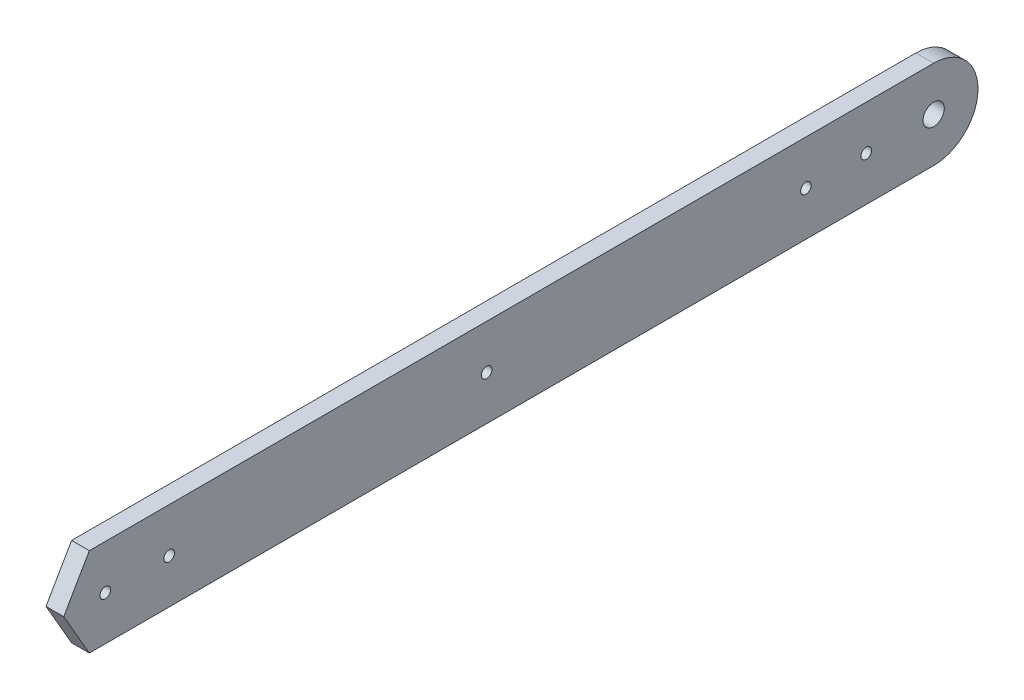
ISO-10303-21;
HEADER;
FILE_DESCRIPTION(('STEP AP214'),'2;1');
FILE_NAME('part.step','',(''),(''),'','','');
FILE_SCHEMA(('AUTOMOTIVE_DESIGN { 1 0 10303 214 1 1 1 1 }'));
ENDSEC;
DATA;
#1=APPLICATION_CONTEXT('core data for automotive mechanical design processes');
#2=APPLICATION_PROTOCOL_DEFINITION('international standard','automotive_design',2000,#1);
#3=PRODUCT_CONTEXT('',#1,'mechanical');
#4=PRODUCT('Part','Part','',(#3));
#5=PRODUCT_RELATED_PRODUCT_CATEGORY('part','',(#4));
#6=PRODUCT_DEFINITION_FORMATION('','',#4);
#7=PRODUCT_DEFINITION_CONTEXT('part definition',#1,'design');
#8=PRODUCT_DEFINITION('design','',#6,#7);
#9=PRODUCT_DEFINITION_SHAPE('','',#8);
#10=(LENGTH_UNIT() NAMED_UNIT(*) SI_UNIT(.MILLI.,.METRE.));
#11=(NAMED_UNIT(*) PLANE_ANGLE_UNIT() SI_UNIT($,.RADIAN.));
#12=(NAMED_UNIT(*) SI_UNIT($,.STERADIAN.) SOLID_ANGLE_UNIT());
#13=UNCERTAINTY_MEASURE_WITH_UNIT(LENGTH_MEASURE(1.E-05),#10,'distance_accuracy_value','');
#14=(GEOMETRIC_REPRESENTATION_CONTEXT(3) GLOBAL_UNCERTAINTY_ASSIGNED_CONTEXT((#13)) GLOBAL_UNIT_ASSIGNED_CONTEXT((#10,
#11,#12)) REPRESENTATION_CONTEXT('',''));
#15=CARTESIAN_POINT('',(0.,0.,0.));
#16=DIRECTION('',(0.,0.,1.));
#17=DIRECTION('',(1.,0.,0.));
#18=AXIS2_PLACEMENT_3D('',#15,#16,#17);
#19=CARTESIAN_POINT('',(-2.5,-12.5,258.5));
#20=DIRECTION('',(0.,1.,0.));
#21=DIRECTION('',(0.,0.,1.));
#22=AXIS2_PLACEMENT_3D('',#19,#20,#21);
#23=PLANE('',#22);
#24=DIRECTION('',(1.,0.,0.));
#25=VECTOR('',#24,1.);
#26=CARTESIAN_POINT('',(-2.5,-12.5,12.5));
#27=LINE('',#26,#25);
#28=CARTESIAN_POINT('',(-2.5,-12.5,12.5));
#29=VERTEX_POINT('',#28);
#30=CARTESIAN_POINT('',(2.5,-12.5,12.5));
#31=VERTEX_POINT('',#30);
#32=EDGE_CURVE('E100',#29,#31,#27,.T.);
#33=ORIENTED_EDGE('',*,*,#32,.T.);
#34=DIRECTION('',(0.,0.,-1.));
#35=VECTOR('',#34,1.);
#36=CARTESIAN_POINT('',(2.5,-12.5,258.5));
#37=LINE('',#36,#35);
#38=CARTESIAN_POINT('',(2.5,-12.5,250.5));
#39=VERTEX_POINT('',#38);
#40=EDGE_CURVE('E95',#39,#31,#37,.T.);
#41=ORIENTED_EDGE('',*,*,#40,.F.);
#42=DIRECTION('',(1.,0.,0.));
#43=VECTOR('',#42,1.);
#44=CARTESIAN_POINT('',(-2.5,-12.5,250.5));
#45=LINE('',#44,#43);
#46=CARTESIAN_POINT('',(-2.5,-12.5,250.5));
#47=VERTEX_POINT('',#46);
#48=EDGE_CURVE('E82',#47,#39,#45,.T.);
#49=ORIENTED_EDGE('',*,*,#48,.F.);
#50=DIRECTION('',(0.,0.,-1.));
#51=VECTOR('',#50,1.);
#52=CARTESIAN_POINT('',(-2.5,-12.5,258.5));
#53=LINE('',#52,#51);
#54=EDGE_CURVE('E101',#47,#29,#53,.T.);
#55=ORIENTED_EDGE('',*,*,#54,.T.);
#56=EDGE_LOOP('',(#33,#41,#49,#55));
#57=FACE_BOUND('',#56,.T.);
#58=ADVANCED_FACE('F37',(#57),#23,.F.);
#59=CARTESIAN_POINT('',(2.5,-12.5,258.5));
#60=DIRECTION('',(-1.,0.,0.));
#61=DIRECTION('',(0.,0.,1.));
#62=AXIS2_PLACEMENT_3D('',#59,#60,#61);
#63=PLANE('',#62);
#64=CARTESIAN_POINT('',(2.5,0.,228.));
#65=DIRECTION('',(1.,0.,0.));
#66=DIRECTION('',(0.,0.,-1.));
#67=AXIS2_PLACEMENT_3D('',#64,#65,#66);
#68=CIRCLE('',#67,1.50000000000003);
#69=CARTESIAN_POINT('',(2.5,0.,226.5));
#70=VERTEX_POINT('',#69);
#71=EDGE_CURVE('E139',#70,#70,#68,.T.);
#72=ORIENTED_EDGE('',*,*,#71,.F.);
#73=EDGE_LOOP('',(#72));
#74=FACE_BOUND('',#73,.T.);
#75=CARTESIAN_POINT('',(2.5,0.,246.));
#76=DIRECTION('',(1.,0.,0.));
#77=DIRECTION('',(0.,0.,-1.));
#78=AXIS2_PLACEMENT_3D('',#75,#76,#77);
#79=CIRCLE('',#78,1.50000000000003);
#80=CARTESIAN_POINT('',(2.5,0.,244.5));
#81=VERTEX_POINT('',#80);
#82=EDGE_CURVE('E133',#81,#81,#79,.T.);
#83=ORIENTED_EDGE('',*,*,#82,.F.);
#84=EDGE_LOOP('',(#83));
#85=FACE_BOUND('',#84,.T.);
#86=CARTESIAN_POINT('',(2.5,0.,48.5));
#87=DIRECTION('',(1.,0.,0.));
#88=DIRECTION('',(0.,0.,-1.));
#89=AXIS2_PLACEMENT_3D('',#86,#87,#88);
#90=CIRCLE('',#89,1.5);
#91=CARTESIAN_POINT('',(2.5,0.,47.));
#92=VERTEX_POINT('',#91);
#93=EDGE_CURVE('E123',#92,#92,#90,.T.);
#94=ORIENTED_EDGE('',*,*,#93,.F.);
#95=EDGE_LOOP('',(#94));
#96=FACE_BOUND('',#95,.T.);
#97=CARTESIAN_POINT('',(2.5,0.,31.5));
#98=DIRECTION('',(1.,0.,0.));
#99=DIRECTION('',(0.,0.,-1.));
#100=AXIS2_PLACEMENT_3D('',#97,#98,#99);
#101=CIRCLE('',#100,1.5);
#102=CARTESIAN_POINT('',(2.5,0.,30.));
#103=VERTEX_POINT('',#102);
#104=EDGE_CURVE('E163',#103,#103,#101,.T.);
#105=ORIENTED_EDGE('',*,*,#104,.F.);
#106=EDGE_LOOP('',(#105));
#107=FACE_BOUND('',#106,.T.);
#108=CARTESIAN_POINT('',(2.5,0.,138.5));
#109=DIRECTION('',(1.,0.,0.));
#110=DIRECTION('',(0.,0.,-1.));
#111=AXIS2_PLACEMENT_3D('',#108,#109,#110);
#112=CIRCLE('',#111,1.5);
#113=CARTESIAN_POINT('',(2.5,0.,137.));
#114=VERTEX_POINT('',#113);
#115=EDGE_CURVE('E167',#114,#114,#112,.T.);
#116=ORIENTED_EDGE('',*,*,#115,.F.);
#117=EDGE_LOOP('',(#116));
#118=FACE_BOUND('',#117,.T.);
#119=CARTESIAN_POINT('',(2.5,0.,12.5));
#120=DIRECTION('',(1.,0.,0.));
#121=DIRECTION('',(0.,0.,-1.));
#122=AXIS2_PLACEMENT_3D('',#119,#120,#121);
#123=CIRCLE('',#122,3.);
#124=CARTESIAN_POINT('',(2.5,0.,9.50000000000001));
#125=VERTEX_POINT('',#124);
#126=EDGE_CURVE('E106',#125,#125,#123,.T.);
#127=ORIENTED_EDGE('',*,*,#126,.F.);
#128=EDGE_LOOP('',(#127));
#129=FACE_BOUND('',#128,.T.);
#130=ORIENTED_EDGE('',*,*,#40,.T.);
#131=CARTESIAN_POINT('',(2.5,0.,12.5));
#132=DIRECTION('',(-1.,0.,0.));
#133=DIRECTION('',(0.,0.,-1.));
#134=AXIS2_PLACEMENT_3D('',#131,#132,#133);
#135=CIRCLE('',#134,12.5);
#136=CARTESIAN_POINT('',(2.5,12.5,12.5));
#137=VERTEX_POINT('',#136);
#138=EDGE_CURVE('E60',#137,#31,#135,.T.);
#139=ORIENTED_EDGE('',*,*,#138,.F.);
#140=DIRECTION('',(0.,0.,-1.));
#141=VECTOR('',#140,1.);
#142=CARTESIAN_POINT('',(2.5,12.5,258.5));
#143=LINE('',#142,#141);
#144=CARTESIAN_POINT('',(2.5,12.5,250.5));
#145=VERTEX_POINT('',#144);
#146=EDGE_CURVE('E11',#145,#137,#143,.T.);
#147=ORIENTED_EDGE('',*,*,#146,.F.);
#148=DIRECTION('',(0.,0.866025403784438,-0.500000000000001));
#149=VECTOR('',#148,1.);
#150=CARTESIAN_POINT('',(2.5,0.,257.71687836487));
#151=LINE('',#150,#149);
#152=CARTESIAN_POINT('',(2.5,0.,257.71687836487));
#153=VERTEX_POINT('',#152);
#154=EDGE_CURVE('E97',#153,#145,#151,.T.);
#155=ORIENTED_EDGE('',*,*,#154,.F.);
#156=DIRECTION('',(0.,0.866025403784438,0.500000000000001));
#157=VECTOR('',#156,1.);
#158=CARTESIAN_POINT('',(2.5,-12.5,250.5));
#159=LINE('',#158,#157);
#160=EDGE_CURVE('E85',#39,#153,#159,.T.);
#161=ORIENTED_EDGE('',*,*,#160,.F.);
#162=EDGE_LOOP('',(#130,#139,#147,#155,#161));
#163=FACE_BOUND('',#162,.T.);
#164=ADVANCED_FACE('F39',(#74,#85,#96,#107,#118,#129,#163),#63,.F.);
#165=CARTESIAN_POINT('',(-2.5,12.5,258.5));
#166=DIRECTION('',(0.,-1.,0.));
#167=DIRECTION('',(0.,0.,-1.));
#168=AXIS2_PLACEMENT_3D('',#165,#166,#167);
#169=PLANE('',#168);
#170=ORIENTED_EDGE('',*,*,#146,.T.);
#171=DIRECTION('',(1.,0.,0.));
#172=VECTOR('',#171,1.);
#173=CARTESIAN_POINT('',(-2.5,12.5,12.5));
#174=LINE('',#173,#172);
#175=CARTESIAN_POINT('',(-2.5,12.5,12.5));
#176=VERTEX_POINT('',#175);
#177=EDGE_CURVE('E122',#176,#137,#174,.T.);
#178=ORIENTED_EDGE('',*,*,#177,.F.);
#179=DIRECTION('',(0.,0.,-1.));
#180=VECTOR('',#179,1.);
#181=CARTESIAN_POINT('',(-2.5,12.5,258.5));
#182=LINE('',#181,#180);
#183=CARTESIAN_POINT('',(-2.5,12.5,250.5));
#184=VERTEX_POINT('',#183);
#185=EDGE_CURVE('E45',#184,#176,#182,.T.);
#186=ORIENTED_EDGE('',*,*,#185,.F.);
#187=DIRECTION('',(1.,0.,0.));
#188=VECTOR('',#187,1.);
#189=CARTESIAN_POINT('',(-2.5,12.5,250.5));
#190=LINE('',#189,#188);
#191=EDGE_CURVE('E91',#184,#145,#190,.T.);
#192=ORIENTED_EDGE('',*,*,#191,.T.);
#193=EDGE_LOOP('',(#170,#178,#186,#192));
#194=FACE_BOUND('',#193,.T.);
#195=ADVANCED_FACE('F121',(#194),#169,.F.);
#196=CARTESIAN_POINT('',(-2.5,-12.5,258.5));
#197=DIRECTION('',(1.,0.,0.));
#198=DIRECTION('',(0.,0.,-1.));
#199=AXIS2_PLACEMENT_3D('',#196,#197,#198);
#200=PLANE('',#199);
#201=CARTESIAN_POINT('',(-2.5,0.,228.));
#202=DIRECTION('',(1.,0.,0.));
#203=DIRECTION('',(0.,0.,-1.));
#204=AXIS2_PLACEMENT_3D('',#201,#202,#203);
#205=CIRCLE('',#204,1.50000000000003);
#206=CARTESIAN_POINT('',(-2.5,0.,226.5));
#207=VERTEX_POINT('',#206);
#208=EDGE_CURVE('E98',#207,#207,#205,.T.);
#209=ORIENTED_EDGE('',*,*,#208,.T.);
#210=EDGE_LOOP('',(#209));
#211=FACE_BOUND('',#210,.T.);
#212=CARTESIAN_POINT('',(-2.5,0.,246.));
#213=DIRECTION('',(1.,0.,0.));
#214=DIRECTION('',(0.,0.,-1.));
#215=AXIS2_PLACEMENT_3D('',#212,#213,#214);
#216=CIRCLE('',#215,1.50000000000003);
#217=CARTESIAN_POINT('',(-2.5,0.,244.5));
#218=VERTEX_POINT('',#217);
#219=EDGE_CURVE('E136',#218,#218,#216,.T.);
#220=ORIENTED_EDGE('',*,*,#219,.T.);
#221=EDGE_LOOP('',(#220));
#222=FACE_BOUND('',#221,.T.);
#223=CARTESIAN_POINT('',(-2.5,0.,48.5));
#224=DIRECTION('',(1.,0.,0.));
#225=DIRECTION('',(0.,0.,-1.));
#226=AXIS2_PLACEMENT_3D('',#223,#224,#225);
#227=CIRCLE('',#226,1.5);
#228=CARTESIAN_POINT('',(-2.5,0.,47.));
#229=VERTEX_POINT('',#228);
#230=EDGE_CURVE('E127',#229,#229,#227,.T.);
#231=ORIENTED_EDGE('',*,*,#230,.T.);
#232=EDGE_LOOP('',(#231));
#233=FACE_BOUND('',#232,.T.);
#234=CARTESIAN_POINT('',(-2.5,0.,31.5));
#235=DIRECTION('',(1.,0.,0.));
#236=DIRECTION('',(0.,0.,-1.));
#237=AXIS2_PLACEMENT_3D('',#234,#235,#236);
#238=CIRCLE('',#237,1.5);
#239=CARTESIAN_POINT('',(-2.5,0.,30.));
#240=VERTEX_POINT('',#239);
#241=EDGE_CURVE('E318',#240,#240,#238,.T.);
#242=ORIENTED_EDGE('',*,*,#241,.T.);
#243=EDGE_LOOP('',(#242));
#244=FACE_BOUND('',#243,.T.);
#245=CARTESIAN_POINT('',(-2.5,0.,138.5));
#246=DIRECTION('',(1.,0.,0.));
#247=DIRECTION('',(0.,0.,-1.));
#248=AXIS2_PLACEMENT_3D('',#245,#246,#247);
#249=CIRCLE('',#248,1.5);
#250=CARTESIAN_POINT('',(-2.5,0.,137.));
#251=VERTEX_POINT('',#250);
#252=EDGE_CURVE('E322',#251,#251,#249,.T.);
#253=ORIENTED_EDGE('',*,*,#252,.T.);
#254=EDGE_LOOP('',(#253));
#255=FACE_BOUND('',#254,.T.);
#256=CARTESIAN_POINT('',(-2.5,0.,12.5));
#257=DIRECTION('',(1.,0.,0.));
#258=DIRECTION('',(0.,0.,-1.));
#259=AXIS2_PLACEMENT_3D('',#256,#257,#258);
#260=CIRCLE('',#259,3.);
#261=CARTESIAN_POINT('',(-2.5,0.,9.50000000000001));
#262=VERTEX_POINT('',#261);
#263=EDGE_CURVE('E102',#262,#262,#260,.T.);
#264=ORIENTED_EDGE('',*,*,#263,.T.);
#265=EDGE_LOOP('',(#264));
#266=FACE_BOUND('',#265,.T.);
#267=ORIENTED_EDGE('',*,*,#185,.T.);
#268=CARTESIAN_POINT('',(-2.5,0.,12.5));
#269=DIRECTION('',(-1.,0.,0.));
#270=DIRECTION('',(0.,0.,-1.));
#271=AXIS2_PLACEMENT_3D('',#268,#269,#270);
#272=CIRCLE('',#271,12.5);
#273=EDGE_CURVE('E115',#176,#29,#272,.T.);
#274=ORIENTED_EDGE('',*,*,#273,.T.);
#275=ORIENTED_EDGE('',*,*,#54,.F.);
#276=DIRECTION('',(0.,0.866025403784438,0.500000000000001));
#277=VECTOR('',#276,1.);
#278=CARTESIAN_POINT('',(-2.5,-12.5,250.5));
#279=LINE('',#278,#277);
#280=CARTESIAN_POINT('',(-2.5,0.,257.71687836487));
#281=VERTEX_POINT('',#280);
#282=EDGE_CURVE('E52',#47,#281,#279,.T.);
#283=ORIENTED_EDGE('',*,*,#282,.T.);
#284=DIRECTION('',(0.,0.866025403784438,-0.500000000000001));
#285=VECTOR('',#284,1.);
#286=CARTESIAN_POINT('',(-2.5,0.,257.71687836487));
#287=LINE('',#286,#285);
#288=EDGE_CURVE('E117',#281,#184,#287,.T.);
#289=ORIENTED_EDGE('',*,*,#288,.T.);
#290=EDGE_LOOP('',(#267,#274,#275,#283,#289));
#291=FACE_BOUND('',#290,.T.);
#292=ADVANCED_FACE('F114',(#211,#222,#233,#244,#255,#266,#291),#200,.F.);
#293=CARTESIAN_POINT('',(-2.5,-12.5,250.5));
#294=DIRECTION('',(0.,0.500000000000001,-0.866025403784438));
#295=DIRECTION('',(0.,0.866025403784438,0.500000000000001));
#296=AXIS2_PLACEMENT_3D('',#293,#294,#295);
#297=PLANE('',#296);
#298=ORIENTED_EDGE('',*,*,#160,.T.);
#299=DIRECTION('',(1.,0.,0.));
#300=VECTOR('',#299,1.);
#301=CARTESIAN_POINT('',(-2.5,0.,257.71687836487));
#302=LINE('',#301,#300);
#303=EDGE_CURVE('E327',#281,#153,#302,.T.);
#304=ORIENTED_EDGE('',*,*,#303,.F.);
#305=ORIENTED_EDGE('',*,*,#282,.F.);
#306=ORIENTED_EDGE('',*,*,#48,.T.);
#307=EDGE_LOOP('',(#298,#304,#305,#306));
#308=FACE_BOUND('',#307,.T.);
#309=ADVANCED_FACE('F84',(#308),#297,.F.);
#310=CARTESIAN_POINT('',(-2.5,0.,257.71687836487));
#311=DIRECTION('',(0.,-0.500000000000001,-0.866025403784438));
#312=DIRECTION('',(0.,0.866025403784438,-0.500000000000001));
#313=AXIS2_PLACEMENT_3D('',#310,#311,#312);
#314=PLANE('',#313);
#315=ORIENTED_EDGE('',*,*,#154,.T.);
#316=ORIENTED_EDGE('',*,*,#191,.F.);
#317=ORIENTED_EDGE('',*,*,#288,.F.);
#318=ORIENTED_EDGE('',*,*,#303,.T.);
#319=EDGE_LOOP('',(#315,#316,#317,#318));
#320=FACE_BOUND('',#319,.T.);
#321=ADVANCED_FACE('F184',(#320),#314,.F.);
#322=CARTESIAN_POINT('',(-2.5,0.,12.5));
#323=DIRECTION('',(1.,0.,0.));
#324=DIRECTION('',(0.,0.,-1.));
#325=AXIS2_PLACEMENT_3D('',#322,#323,#324);
#326=CYLINDRICAL_SURFACE('',#325,12.5);
#327=ORIENTED_EDGE('',*,*,#138,.T.);
#328=ORIENTED_EDGE('',*,*,#32,.F.);
#329=ORIENTED_EDGE('',*,*,#273,.F.);
#330=ORIENTED_EDGE('',*,*,#177,.T.);
#331=EDGE_LOOP('',(#327,#328,#329,#330));
#332=FACE_BOUND('',#331,.T.);
#333=ADVANCED_FACE('F174',(#332),#326,.T.);
#334=CARTESIAN_POINT('',(-2.5,0.,12.5));
#335=DIRECTION('',(1.,0.,0.));
#336=DIRECTION('',(0.,0.,-1.));
#337=AXIS2_PLACEMENT_3D('',#334,#335,#336);
#338=CYLINDRICAL_SURFACE('',#337,3.);
#339=ORIENTED_EDGE('',*,*,#263,.F.);
#340=EDGE_LOOP('',(#339));
#341=FACE_BOUND('',#340,.T.);
#342=ORIENTED_EDGE('',*,*,#126,.T.);
#343=EDGE_LOOP('',(#342));
#344=FACE_BOUND('',#343,.T.);
#345=ADVANCED_FACE('F171',(#341,#344),#338,.F.);
#346=CARTESIAN_POINT('',(-2.5,0.,138.5));
#347=DIRECTION('',(1.,0.,0.));
#348=DIRECTION('',(0.,0.,-1.));
#349=AXIS2_PLACEMENT_3D('',#346,#347,#348);
#350=CYLINDRICAL_SURFACE('',#349,1.5);
#351=ORIENTED_EDGE('',*,*,#252,.F.);
#352=EDGE_LOOP('',(#351));
#353=FACE_BOUND('',#352,.T.);
#354=ORIENTED_EDGE('',*,*,#115,.T.);
#355=EDGE_LOOP('',(#354));
#356=FACE_BOUND('',#355,.T.);
#357=ADVANCED_FACE('F173',(#353,#356),#350,.F.);
#358=CARTESIAN_POINT('',(-2.5,0.,31.5));
#359=DIRECTION('',(1.,0.,0.));
#360=DIRECTION('',(0.,0.,-1.));
#361=AXIS2_PLACEMENT_3D('',#358,#359,#360);
#362=CYLINDRICAL_SURFACE('',#361,1.5);
#363=ORIENTED_EDGE('',*,*,#241,.F.);
#364=EDGE_LOOP('',(#363));
#365=FACE_BOUND('',#364,.T.);
#366=ORIENTED_EDGE('',*,*,#104,.T.);
#367=EDGE_LOOP('',(#366));
#368=FACE_BOUND('',#367,.T.);
#369=ADVANCED_FACE('F181',(#365,#368),#362,.F.);
#370=CARTESIAN_POINT('',(-2.5,0.,48.5));
#371=DIRECTION('',(1.,0.,0.));
#372=DIRECTION('',(0.,0.,-1.));
#373=AXIS2_PLACEMENT_3D('',#370,#371,#372);
#374=CYLINDRICAL_SURFACE('',#373,1.5);
#375=ORIENTED_EDGE('',*,*,#230,.F.);
#376=EDGE_LOOP('',(#375));
#377=FACE_BOUND('',#376,.T.);
#378=ORIENTED_EDGE('',*,*,#93,.T.);
#379=EDGE_LOOP('',(#378));
#380=FACE_BOUND('',#379,.T.);
#381=ADVANCED_FACE('F241',(#377,#380),#374,.F.);
#382=CARTESIAN_POINT('',(-2.5,0.,246.));
#383=DIRECTION('',(1.,0.,0.));
#384=DIRECTION('',(0.,0.,-1.));
#385=AXIS2_PLACEMENT_3D('',#382,#383,#384);
#386=CYLINDRICAL_SURFACE('',#385,1.50000000000003);
#387=ORIENTED_EDGE('',*,*,#219,.F.);
#388=EDGE_LOOP('',(#387));
#389=FACE_BOUND('',#388,.T.);
#390=ORIENTED_EDGE('',*,*,#82,.T.);
#391=EDGE_LOOP('',(#390));
#392=FACE_BOUND('',#391,.T.);
#393=ADVANCED_FACE('F150',(#389,#392),#386,.F.);
#394=CARTESIAN_POINT('',(-2.5,0.,228.));
#395=DIRECTION('',(1.,0.,0.));
#396=DIRECTION('',(0.,0.,-1.));
#397=AXIS2_PLACEMENT_3D('',#394,#395,#396);
#398=CYLINDRICAL_SURFACE('',#397,1.50000000000003);
#399=ORIENTED_EDGE('',*,*,#208,.F.);
#400=EDGE_LOOP('',(#399));
#401=FACE_BOUND('',#400,.T.);
#402=ORIENTED_EDGE('',*,*,#71,.T.);
#403=EDGE_LOOP('',(#402));
#404=FACE_BOUND('',#403,.T.);
#405=ADVANCED_FACE('F147',(#401,#404),#398,.F.);
#406=CLOSED_SHELL('',(#58,#164,#195,#292,#309,#321,#333,#345,#357,#369,#381,#393,#405));
#407=MANIFOLD_SOLID_BREP('B2',#406);
#408=ADVANCED_BREP_SHAPE_REPRESENTATION('',(#18,#407),#14);
#409=SHAPE_DEFINITION_REPRESENTATION(#9,#408);
ENDSEC;
END-ISO-10303-21;
